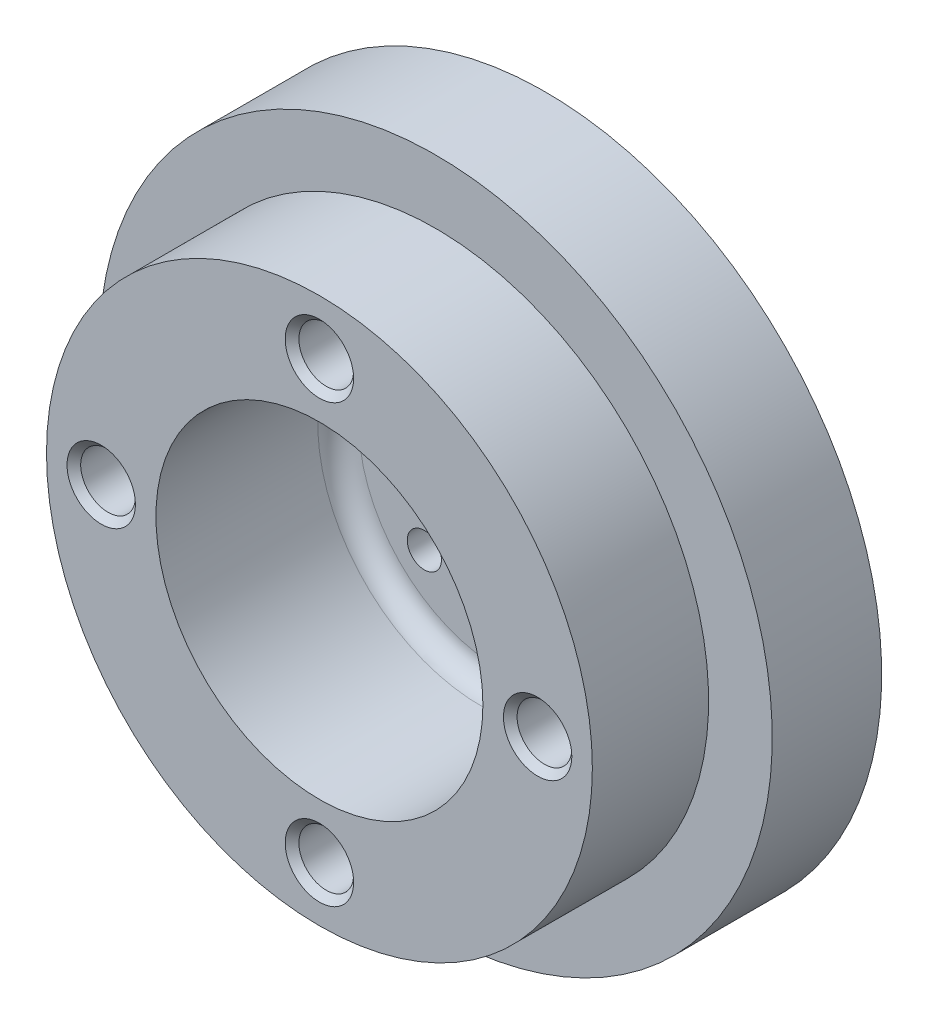
ISO-10303-21;
HEADER;
FILE_DESCRIPTION(('STEP AP214'),'2;1');
FILE_NAME('part.step','',(''),(''),'','','');
FILE_SCHEMA(('AUTOMOTIVE_DESIGN { 1 0 10303 214 1 1 1 1 }'));
ENDSEC;
DATA;
#1=APPLICATION_CONTEXT('core data for automotive mechanical design processes');
#2=APPLICATION_PROTOCOL_DEFINITION('international standard','automotive_design',2000,#1);
#3=PRODUCT_CONTEXT('',#1,'mechanical');
#4=PRODUCT('Part','Part','',(#3));
#5=PRODUCT_RELATED_PRODUCT_CATEGORY('part','',(#4));
#6=PRODUCT_DEFINITION_FORMATION('','',#4);
#7=PRODUCT_DEFINITION_CONTEXT('part definition',#1,'design');
#8=PRODUCT_DEFINITION('design','',#6,#7);
#9=PRODUCT_DEFINITION_SHAPE('','',#8);
#10=(LENGTH_UNIT() NAMED_UNIT(*) SI_UNIT(.MILLI.,.METRE.));
#11=(NAMED_UNIT(*) PLANE_ANGLE_UNIT() SI_UNIT($,.RADIAN.));
#12=(NAMED_UNIT(*) SI_UNIT($,.STERADIAN.) SOLID_ANGLE_UNIT());
#13=UNCERTAINTY_MEASURE_WITH_UNIT(LENGTH_MEASURE(1.E-05),#10,'distance_accuracy_value','');
#14=(GEOMETRIC_REPRESENTATION_CONTEXT(3) GLOBAL_UNCERTAINTY_ASSIGNED_CONTEXT((#13)) GLOBAL_UNIT_ASSIGNED_CONTEXT((#10,
#11,#12)) REPRESENTATION_CONTEXT('',''));
#15=CARTESIAN_POINT('',(0.,0.,0.));
#16=DIRECTION('',(0.,0.,1.));
#17=DIRECTION('',(1.,0.,0.));
#18=AXIS2_PLACEMENT_3D('',#15,#16,#17);
#19=CARTESIAN_POINT('',(1.96630971620501E-13,12.,73.4271211386865));
#20=DIRECTION('',(0.,0.,-1.));
#21=DIRECTION('',(-1.,0.,0.));
#22=AXIS2_PLACEMENT_3D('',#19,#20,#21);
#23=CYLINDRICAL_SURFACE('',#22,19.95);
#24=CARTESIAN_POINT('',(1.96630971620501E-13,12.,16.5));
#25=DIRECTION('',(0.,0.,1.));
#26=DIRECTION('',(1.,0.,0.));
#27=AXIS2_PLACEMENT_3D('',#24,#25,#26);
#28=CIRCLE('',#27,19.95);
#29=CARTESIAN_POINT('',(19.9500000000002,12.,16.5));
#30=VERTEX_POINT('',#29);
#31=EDGE_CURVE('E127',#30,#30,#28,.T.);
#32=ORIENTED_EDGE('',*,*,#31,.F.);
#33=EDGE_LOOP('',(#32));
#34=FACE_BOUND('',#33,.T.);
#35=CARTESIAN_POINT('',(1.96630971620501E-13,12.,8.00000000000004));
#36=DIRECTION('',(0.,0.,-1.));
#37=DIRECTION('',(-1.,0.,0.));
#38=AXIS2_PLACEMENT_3D('',#35,#36,#37);
#39=CIRCLE('',#38,19.95);
#40=CARTESIAN_POINT('',(-19.9499999999998,12.,8.00000000000004));
#41=VERTEX_POINT('',#40);
#42=EDGE_CURVE('E72',#41,#41,#39,.T.);
#43=ORIENTED_EDGE('',*,*,#42,.F.);
#44=EDGE_LOOP('',(#43));
#45=FACE_BOUND('',#44,.T.);
#46=ADVANCED_FACE('F34',(#34,#45),#23,.T.);
#47=CARTESIAN_POINT('',(0.,12.,3.175));
#48=DIRECTION('',(0.,0.,1.));
#49=DIRECTION('',(1.,0.,0.));
#50=AXIS2_PLACEMENT_3D('',#47,#48,#49);
#51=PLANE('',#50);
#52=CARTESIAN_POINT('',(1.41119820389243E-13,12.,3.175));
#53=DIRECTION('',(0.,0.,1.));
#54=DIRECTION('',(1.,0.,0.));
#55=AXIS2_PLACEMENT_3D('',#52,#53,#54);
#56=CIRCLE('',#55,10.45);
#57=CARTESIAN_POINT('',(10.4500000000001,12.,3.175));
#58=VERTEX_POINT('',#57);
#59=EDGE_CURVE('E10',#58,#58,#56,.T.);
#60=ORIENTED_EDGE('',*,*,#59,.T.);
#61=EDGE_LOOP('',(#60));
#62=FACE_BOUND('',#61,.T.);
#63=CARTESIAN_POINT('',(8.00000000000011,12.,3.175));
#64=DIRECTION('',(0.,0.,1.));
#65=DIRECTION('',(1.,0.,0.));
#66=AXIS2_PLACEMENT_3D('',#63,#64,#65);
#67=CIRCLE('',#66,1.24999999999981);
#68=CARTESIAN_POINT('',(9.24999999999992,12.,3.175));
#69=VERTEX_POINT('',#68);
#70=EDGE_CURVE('E121',#69,#69,#67,.T.);
#71=ORIENTED_EDGE('',*,*,#70,.F.);
#72=EDGE_LOOP('',(#71));
#73=FACE_BOUND('',#72,.T.);
#74=CARTESIAN_POINT('',(-5.65685424949228,17.6568542494924,3.175));
#75=DIRECTION('',(0.,0.,1.));
#76=DIRECTION('',(1.,0.,0.));
#77=AXIS2_PLACEMENT_3D('',#74,#75,#76);
#78=CIRCLE('',#77,1.25);
#79=CARTESIAN_POINT('',(-4.40685424949228,17.6568542494924,3.175));
#80=VERTEX_POINT('',#79);
#81=EDGE_CURVE('E109',#80,#80,#78,.T.);
#82=ORIENTED_EDGE('',*,*,#81,.F.);
#83=EDGE_LOOP('',(#82));
#84=FACE_BOUND('',#83,.T.);
#85=CARTESIAN_POINT('',(-5.65685424949246,6.34314575050743,3.175));
#86=DIRECTION('',(0.,0.,1.));
#87=DIRECTION('',(1.,0.,0.));
#88=AXIS2_PLACEMENT_3D('',#85,#86,#87);
#89=CIRCLE('',#88,1.24999999999988);
#90=CARTESIAN_POINT('',(-4.40685424949258,6.34314575050743,3.175));
#91=VERTEX_POINT('',#90);
#92=EDGE_CURVE('E97',#91,#91,#89,.T.);
#93=ORIENTED_EDGE('',*,*,#92,.F.);
#94=EDGE_LOOP('',(#93));
#95=FACE_BOUND('',#94,.T.);
#96=CARTESIAN_POINT('',(0.,3.99999999999978,3.175));
#97=DIRECTION('',(0.,0.,1.));
#98=DIRECTION('',(1.,0.,0.));
#99=AXIS2_PLACEMENT_3D('',#96,#97,#98);
#100=CIRCLE('',#99,1.24999999999977);
#101=CARTESIAN_POINT('',(1.24999999999977,3.99999999999978,3.175));
#102=VERTEX_POINT('',#101);
#103=EDGE_CURVE('E85',#102,#102,#100,.T.);
#104=ORIENTED_EDGE('',*,*,#103,.F.);
#105=EDGE_LOOP('',(#104));
#106=FACE_BOUND('',#105,.T.);
#107=CARTESIAN_POINT('',(0.,12.,3.175));
#108=DIRECTION('',(0.,0.,1.));
#109=DIRECTION('',(1.,0.,0.));
#110=AXIS2_PLACEMENT_3D('',#107,#108,#109);
#111=CIRCLE('',#110,4.2);
#112=CARTESIAN_POINT('',(4.2,12.,3.175));
#113=VERTEX_POINT('',#112);
#114=EDGE_CURVE('E75',#113,#113,#111,.T.);
#115=ORIENTED_EDGE('',*,*,#114,.F.);
#116=EDGE_LOOP('',(#115));
#117=FACE_BOUND('',#116,.T.);
#118=CARTESIAN_POINT('',(5.65685424949246,6.34314575050743,3.175));
#119=DIRECTION('',(0.,0.,1.));
#120=DIRECTION('',(1.,0.,0.));
#121=AXIS2_PLACEMENT_3D('',#118,#119,#120);
#122=CIRCLE('',#121,1.24999999999975);
#123=CARTESIAN_POINT('',(6.90685424949221,6.34314575050743,3.175));
#124=VERTEX_POINT('',#123);
#125=EDGE_CURVE('E79',#124,#124,#122,.T.);
#126=ORIENTED_EDGE('',*,*,#125,.F.);
#127=EDGE_LOOP('',(#126));
#128=FACE_BOUND('',#127,.T.);
#129=CARTESIAN_POINT('',(5.65685424949246,17.6568542494924,3.175));
#130=DIRECTION('',(0.,0.,1.));
#131=DIRECTION('',(1.,0.,0.));
#132=AXIS2_PLACEMENT_3D('',#129,#130,#131);
#133=CIRCLE('',#132,1.24999999999992);
#134=CARTESIAN_POINT('',(6.90685424949238,17.6568542494924,3.175));
#135=VERTEX_POINT('',#134);
#136=EDGE_CURVE('E91',#135,#135,#133,.T.);
#137=ORIENTED_EDGE('',*,*,#136,.F.);
#138=EDGE_LOOP('',(#137));
#139=FACE_BOUND('',#138,.T.);
#140=CARTESIAN_POINT('',(-8.00000000000012,12.,3.175));
#141=DIRECTION('',(0.,0.,1.));
#142=DIRECTION('',(1.,0.,0.));
#143=AXIS2_PLACEMENT_3D('',#140,#141,#142);
#144=CIRCLE('',#143,1.25000000000002);
#145=CARTESIAN_POINT('',(-6.7500000000001,12.,3.175));
#146=VERTEX_POINT('',#145);
#147=EDGE_CURVE('E103',#146,#146,#144,.T.);
#148=ORIENTED_EDGE('',*,*,#147,.F.);
#149=EDGE_LOOP('',(#148));
#150=FACE_BOUND('',#149,.T.);
#151=CARTESIAN_POINT('',(0.,20.,3.175));
#152=DIRECTION('',(0.,0.,1.));
#153=DIRECTION('',(1.,0.,0.));
#154=AXIS2_PLACEMENT_3D('',#151,#152,#153);
#155=CIRCLE('',#154,1.25);
#156=CARTESIAN_POINT('',(1.25,20.,3.175));
#157=VERTEX_POINT('',#156);
#158=EDGE_CURVE('E115',#157,#157,#155,.T.);
#159=ORIENTED_EDGE('',*,*,#158,.F.);
#160=EDGE_LOOP('',(#159));
#161=FACE_BOUND('',#160,.T.);
#162=ADVANCED_FACE('F166',(#62,#73,#84,#95,#106,#117,#128,#139,#150,#161),#51,.T.);
#163=CARTESIAN_POINT('',(0.,12.,0.));
#164=DIRECTION('',(0.,0.,1.));
#165=DIRECTION('',(1.,0.,0.));
#166=AXIS2_PLACEMENT_3D('',#163,#164,#165);
#167=PLANE('',#166);
#168=CARTESIAN_POINT('',(1.96023752785379E-13,-3.95,0.));
#169=DIRECTION('',(0.,0.,1.));
#170=DIRECTION('',(0.,1.,0.));
#171=AXIS2_PLACEMENT_3D('',#168,#169,#170);
#172=CIRCLE('',#171,2.);
#173=CARTESIAN_POINT('',(1.89040790107693E-13,-1.94999999999999,0.));
#174=VERTEX_POINT('',#173);
#175=EDGE_CURVE('E138',#174,#174,#172,.T.);
#176=ORIENTED_EDGE('',*,*,#175,.T.);
#177=EDGE_LOOP('',(#176));
#178=FACE_BOUND('',#177,.T.);
#179=CARTESIAN_POINT('',(15.9500000000001,12.,0.));
#180=DIRECTION('',(0.,0.,1.));
#181=DIRECTION('',(-1.,0.,0.));
#182=AXIS2_PLACEMENT_3D('',#179,#180,#181);
#183=CIRCLE('',#182,2.);
#184=CARTESIAN_POINT('',(13.9500000000001,12.,0.));
#185=VERTEX_POINT('',#184);
#186=EDGE_CURVE('E142',#185,#185,#183,.T.);
#187=ORIENTED_EDGE('',*,*,#186,.T.);
#188=EDGE_LOOP('',(#187));
#189=FACE_BOUND('',#188,.T.);
#190=CARTESIAN_POINT('',(0.,27.9499999999999,0.));
#191=DIRECTION('',(0.,0.,1.));
#192=DIRECTION('',(0.,-1.,0.));
#193=AXIS2_PLACEMENT_3D('',#190,#191,#192);
#194=CIRCLE('',#193,2.);
#195=CARTESIAN_POINT('',(0.,25.9499999999999,0.));
#196=VERTEX_POINT('',#195);
#197=EDGE_CURVE('E139',#196,#196,#194,.T.);
#198=ORIENTED_EDGE('',*,*,#197,.T.);
#199=EDGE_LOOP('',(#198));
#200=FACE_BOUND('',#199,.T.);
#201=CARTESIAN_POINT('',(-15.9499999999998,12.,0.));
#202=DIRECTION('',(0.,0.,1.));
#203=DIRECTION('',(1.,0.,0.));
#204=AXIS2_PLACEMENT_3D('',#201,#202,#203);
#205=CIRCLE('',#204,2.);
#206=CARTESIAN_POINT('',(-13.9499999999998,12.,0.));
#207=VERTEX_POINT('',#206);
#208=EDGE_CURVE('E133',#207,#207,#205,.T.);
#209=ORIENTED_EDGE('',*,*,#208,.T.);
#210=EDGE_LOOP('',(#209));
#211=FACE_BOUND('',#210,.T.);
#212=CARTESIAN_POINT('',(0.,12.,0.));
#213=DIRECTION('',(0.,0.,1.));
#214=DIRECTION('',(1.,0.,0.));
#215=AXIS2_PLACEMENT_3D('',#212,#213,#214);
#216=CIRCLE('',#215,4.2);
#217=CARTESIAN_POINT('',(4.2,12.,0.));
#218=VERTEX_POINT('',#217);
#219=EDGE_CURVE('E76',#218,#218,#216,.T.);
#220=ORIENTED_EDGE('',*,*,#219,.T.);
#221=EDGE_LOOP('',(#220));
#222=FACE_BOUND('',#221,.T.);
#223=CARTESIAN_POINT('',(5.65685424949246,6.34314575050743,0.));
#224=DIRECTION('',(0.,0.,1.));
#225=DIRECTION('',(1.,0.,0.));
#226=AXIS2_PLACEMENT_3D('',#223,#224,#225);
#227=CIRCLE('',#226,1.24999999999975);
#228=CARTESIAN_POINT('',(6.90685424949221,6.34314575050743,0.));
#229=VERTEX_POINT('',#228);
#230=EDGE_CURVE('E82',#229,#229,#227,.T.);
#231=ORIENTED_EDGE('',*,*,#230,.T.);
#232=EDGE_LOOP('',(#231));
#233=FACE_BOUND('',#232,.T.);
#234=CARTESIAN_POINT('',(0.,3.99999999999978,0.));
#235=DIRECTION('',(0.,0.,1.));
#236=DIRECTION('',(1.,0.,0.));
#237=AXIS2_PLACEMENT_3D('',#234,#235,#236);
#238=CIRCLE('',#237,1.24999999999977);
#239=CARTESIAN_POINT('',(1.24999999999977,3.99999999999978,0.));
#240=VERTEX_POINT('',#239);
#241=EDGE_CURVE('E88',#240,#240,#238,.T.);
#242=ORIENTED_EDGE('',*,*,#241,.T.);
#243=EDGE_LOOP('',(#242));
#244=FACE_BOUND('',#243,.T.);
#245=CARTESIAN_POINT('',(5.65685424949246,17.6568542494924,0.));
#246=DIRECTION('',(0.,0.,1.));
#247=DIRECTION('',(1.,0.,0.));
#248=AXIS2_PLACEMENT_3D('',#245,#246,#247);
#249=CIRCLE('',#248,1.24999999999992);
#250=CARTESIAN_POINT('',(6.90685424949238,17.6568542494924,0.));
#251=VERTEX_POINT('',#250);
#252=EDGE_CURVE('E94',#251,#251,#249,.T.);
#253=ORIENTED_EDGE('',*,*,#252,.T.);
#254=EDGE_LOOP('',(#253));
#255=FACE_BOUND('',#254,.T.);
#256=CARTESIAN_POINT('',(-5.65685424949246,6.34314575050743,0.));
#257=DIRECTION('',(0.,0.,1.));
#258=DIRECTION('',(1.,0.,0.));
#259=AXIS2_PLACEMENT_3D('',#256,#257,#258);
#260=CIRCLE('',#259,1.24999999999988);
#261=CARTESIAN_POINT('',(-4.40685424949258,6.34314575050743,0.));
#262=VERTEX_POINT('',#261);
#263=EDGE_CURVE('E100',#262,#262,#260,.T.);
#264=ORIENTED_EDGE('',*,*,#263,.T.);
#265=EDGE_LOOP('',(#264));
#266=FACE_BOUND('',#265,.T.);
#267=CARTESIAN_POINT('',(-8.00000000000012,12.,0.));
#268=DIRECTION('',(0.,0.,1.));
#269=DIRECTION('',(1.,0.,0.));
#270=AXIS2_PLACEMENT_3D('',#267,#268,#269);
#271=CIRCLE('',#270,1.25000000000002);
#272=CARTESIAN_POINT('',(-6.7500000000001,12.,0.));
#273=VERTEX_POINT('',#272);
#274=EDGE_CURVE('E106',#273,#273,#271,.T.);
#275=ORIENTED_EDGE('',*,*,#274,.T.);
#276=EDGE_LOOP('',(#275));
#277=FACE_BOUND('',#276,.T.);
#278=CARTESIAN_POINT('',(-5.65685424949228,17.6568542494924,0.));
#279=DIRECTION('',(0.,0.,1.));
#280=DIRECTION('',(1.,0.,0.));
#281=AXIS2_PLACEMENT_3D('',#278,#279,#280);
#282=CIRCLE('',#281,1.25);
#283=CARTESIAN_POINT('',(-4.40685424949228,17.6568542494924,0.));
#284=VERTEX_POINT('',#283);
#285=EDGE_CURVE('E112',#284,#284,#282,.T.);
#286=ORIENTED_EDGE('',*,*,#285,.T.);
#287=EDGE_LOOP('',(#286));
#288=FACE_BOUND('',#287,.T.);
#289=CARTESIAN_POINT('',(0.,20.,0.));
#290=DIRECTION('',(0.,0.,1.));
#291=DIRECTION('',(1.,0.,0.));
#292=AXIS2_PLACEMENT_3D('',#289,#290,#291);
#293=CIRCLE('',#292,1.25);
#294=CARTESIAN_POINT('',(1.25,20.,0.));
#295=VERTEX_POINT('',#294);
#296=EDGE_CURVE('E118',#295,#295,#293,.T.);
#297=ORIENTED_EDGE('',*,*,#296,.T.);
#298=EDGE_LOOP('',(#297));
#299=FACE_BOUND('',#298,.T.);
#300=CARTESIAN_POINT('',(8.00000000000011,12.,0.));
#301=DIRECTION('',(0.,0.,1.));
#302=DIRECTION('',(1.,0.,0.));
#303=AXIS2_PLACEMENT_3D('',#300,#301,#302);
#304=CIRCLE('',#303,1.24999999999981);
#305=CARTESIAN_POINT('',(9.24999999999992,12.,0.));
#306=VERTEX_POINT('',#305);
#307=EDGE_CURVE('E124',#306,#306,#304,.T.);
#308=ORIENTED_EDGE('',*,*,#307,.T.);
#309=EDGE_LOOP('',(#308));
#310=FACE_BOUND('',#309,.T.);
#311=CARTESIAN_POINT('',(0.,12.,0.));
#312=DIRECTION('',(0.,0.,-1.));
#313=DIRECTION('',(-1.,0.,0.));
#314=AXIS2_PLACEMENT_3D('',#311,#312,#313);
#315=CIRCLE('',#314,24.5999999999998);
#316=CARTESIAN_POINT('',(-24.5999999999998,12.,0.));
#317=VERTEX_POINT('',#316);
#318=EDGE_CURVE('E148',#317,#317,#315,.T.);
#319=ORIENTED_EDGE('',*,*,#318,.T.);
#320=EDGE_LOOP('',(#319));
#321=FACE_BOUND('',#320,.T.);
#322=ADVANCED_FACE('F163',(#178,#189,#200,#211,#222,#233,#244,#255,#266,#277,#288,#299,#310,
#321),#167,.F.);
#323=CARTESIAN_POINT('',(0.,12.,3.175));
#324=DIRECTION('',(0.,0.,-1.));
#325=DIRECTION('',(-1.,0.,0.));
#326=AXIS2_PLACEMENT_3D('',#323,#324,#325);
#327=CYLINDRICAL_SURFACE('',#326,4.2);
#328=ORIENTED_EDGE('',*,*,#114,.T.);
#329=EDGE_LOOP('',(#328));
#330=FACE_BOUND('',#329,.T.);
#331=ORIENTED_EDGE('',*,*,#219,.F.);
#332=EDGE_LOOP('',(#331));
#333=FACE_BOUND('',#332,.T.);
#334=ADVANCED_FACE('F165',(#330,#333),#327,.F.);
#335=CARTESIAN_POINT('',(5.65685424949246,6.34314575050743,3.175));
#336=DIRECTION('',(0.,0.,-1.));
#337=DIRECTION('',(-1.,0.,0.));
#338=AXIS2_PLACEMENT_3D('',#335,#336,#337);
#339=CYLINDRICAL_SURFACE('',#338,1.24999999999975);
#340=ORIENTED_EDGE('',*,*,#125,.T.);
#341=EDGE_LOOP('',(#340));
#342=FACE_BOUND('',#341,.T.);
#343=ORIENTED_EDGE('',*,*,#230,.F.);
#344=EDGE_LOOP('',(#343));
#345=FACE_BOUND('',#344,.T.);
#346=ADVANCED_FACE('F173',(#342,#345),#339,.F.);
#347=CARTESIAN_POINT('',(0.,3.99999999999978,3.175));
#348=DIRECTION('',(0.,0.,-1.));
#349=DIRECTION('',(-1.,0.,0.));
#350=AXIS2_PLACEMENT_3D('',#347,#348,#349);
#351=CYLINDRICAL_SURFACE('',#350,1.24999999999977);
#352=ORIENTED_EDGE('',*,*,#103,.T.);
#353=EDGE_LOOP('',(#352));
#354=FACE_BOUND('',#353,.T.);
#355=ORIENTED_EDGE('',*,*,#241,.F.);
#356=EDGE_LOOP('',(#355));
#357=FACE_BOUND('',#356,.T.);
#358=ADVANCED_FACE('F213',(#354,#357),#351,.F.);
#359=CARTESIAN_POINT('',(5.65685424949246,17.6568542494924,3.175));
#360=DIRECTION('',(0.,0.,-1.));
#361=DIRECTION('',(-1.,0.,0.));
#362=AXIS2_PLACEMENT_3D('',#359,#360,#361);
#363=CYLINDRICAL_SURFACE('',#362,1.24999999999992);
#364=ORIENTED_EDGE('',*,*,#136,.T.);
#365=EDGE_LOOP('',(#364));
#366=FACE_BOUND('',#365,.T.);
#367=ORIENTED_EDGE('',*,*,#252,.F.);
#368=EDGE_LOOP('',(#367));
#369=FACE_BOUND('',#368,.T.);
#370=ADVANCED_FACE('F209',(#366,#369),#363,.F.);
#371=CARTESIAN_POINT('',(-5.65685424949246,6.34314575050743,3.175));
#372=DIRECTION('',(0.,0.,-1.));
#373=DIRECTION('',(-1.,0.,0.));
#374=AXIS2_PLACEMENT_3D('',#371,#372,#373);
#375=CYLINDRICAL_SURFACE('',#374,1.24999999999988);
#376=ORIENTED_EDGE('',*,*,#92,.T.);
#377=EDGE_LOOP('',(#376));
#378=FACE_BOUND('',#377,.T.);
#379=ORIENTED_EDGE('',*,*,#263,.F.);
#380=EDGE_LOOP('',(#379));
#381=FACE_BOUND('',#380,.T.);
#382=ADVANCED_FACE('F205',(#378,#381),#375,.F.);
#383=CARTESIAN_POINT('',(-8.00000000000012,12.,3.175));
#384=DIRECTION('',(0.,0.,-1.));
#385=DIRECTION('',(-1.,0.,0.));
#386=AXIS2_PLACEMENT_3D('',#383,#384,#385);
#387=CYLINDRICAL_SURFACE('',#386,1.25000000000002);
#388=ORIENTED_EDGE('',*,*,#147,.T.);
#389=EDGE_LOOP('',(#388));
#390=FACE_BOUND('',#389,.T.);
#391=ORIENTED_EDGE('',*,*,#274,.F.);
#392=EDGE_LOOP('',(#391));
#393=FACE_BOUND('',#392,.T.);
#394=ADVANCED_FACE('F201',(#390,#393),#387,.F.);
#395=CARTESIAN_POINT('',(-5.65685424949228,17.6568542494924,3.175));
#396=DIRECTION('',(0.,0.,-1.));
#397=DIRECTION('',(-1.,0.,0.));
#398=AXIS2_PLACEMENT_3D('',#395,#396,#397);
#399=CYLINDRICAL_SURFACE('',#398,1.25);
#400=ORIENTED_EDGE('',*,*,#81,.T.);
#401=EDGE_LOOP('',(#400));
#402=FACE_BOUND('',#401,.T.);
#403=ORIENTED_EDGE('',*,*,#285,.F.);
#404=EDGE_LOOP('',(#403));
#405=FACE_BOUND('',#404,.T.);
#406=ADVANCED_FACE('F197',(#402,#405),#399,.F.);
#407=CARTESIAN_POINT('',(0.,20.,3.175));
#408=DIRECTION('',(0.,0.,-1.));
#409=DIRECTION('',(-1.,0.,0.));
#410=AXIS2_PLACEMENT_3D('',#407,#408,#409);
#411=CYLINDRICAL_SURFACE('',#410,1.25);
#412=ORIENTED_EDGE('',*,*,#158,.T.);
#413=EDGE_LOOP('',(#412));
#414=FACE_BOUND('',#413,.T.);
#415=ORIENTED_EDGE('',*,*,#296,.F.);
#416=EDGE_LOOP('',(#415));
#417=FACE_BOUND('',#416,.T.);
#418=ADVANCED_FACE('F193',(#414,#417),#411,.F.);
#419=CARTESIAN_POINT('',(8.00000000000011,12.,3.175));
#420=DIRECTION('',(0.,0.,-1.));
#421=DIRECTION('',(-1.,0.,0.));
#422=AXIS2_PLACEMENT_3D('',#419,#420,#421);
#423=CYLINDRICAL_SURFACE('',#422,1.24999999999981);
#424=ORIENTED_EDGE('',*,*,#70,.T.);
#425=EDGE_LOOP('',(#424));
#426=FACE_BOUND('',#425,.T.);
#427=ORIENTED_EDGE('',*,*,#307,.F.);
#428=EDGE_LOOP('',(#427));
#429=FACE_BOUND('',#428,.T.);
#430=ADVANCED_FACE('F190',(#426,#429),#423,.F.);
#431=CARTESIAN_POINT('',(1.41119820389243E-13,12.,73.4271211386865));
#432=DIRECTION('',(0.,0.,-1.));
#433=DIRECTION('',(-1.,0.,0.));
#434=AXIS2_PLACEMENT_3D('',#431,#432,#433);
#435=CYLINDRICAL_SURFACE('',#434,11.95);
#436=CARTESIAN_POINT('',(1.41119820389243E-13,12.,4.675));
#437=DIRECTION('',(0.,0.,1.));
#438=DIRECTION('',(1.,0.,0.));
#439=AXIS2_PLACEMENT_3D('',#436,#437,#438);
#440=CIRCLE('',#439,11.95);
#441=CARTESIAN_POINT('',(11.9500000000001,12.,4.675));
#442=VERTEX_POINT('',#441);
#443=EDGE_CURVE('E41',#442,#442,#440,.F.);
#444=ORIENTED_EDGE('',*,*,#443,.T.);
#445=EDGE_LOOP('',(#444));
#446=FACE_BOUND('',#445,.T.);
#447=CARTESIAN_POINT('',(1.41119820389243E-13,12.,16.5));
#448=DIRECTION('',(0.,0.,1.));
#449=DIRECTION('',(1.,0.,0.));
#450=AXIS2_PLACEMENT_3D('',#447,#448,#449);
#451=CIRCLE('',#450,11.95);
#452=CARTESIAN_POINT('',(11.9500000000001,12.,16.5));
#453=VERTEX_POINT('',#452);
#454=EDGE_CURVE('E130',#453,#453,#451,.T.);
#455=ORIENTED_EDGE('',*,*,#454,.T.);
#456=EDGE_LOOP('',(#455));
#457=FACE_BOUND('',#456,.T.);
#458=ADVANCED_FACE('F188',(#446,#457),#435,.F.);
#459=CARTESIAN_POINT('',(25.0569780560725,-12.6,16.5));
#460=DIRECTION('',(0.,0.,1.));
#461=DIRECTION('',(0.,1.,0.));
#462=AXIS2_PLACEMENT_3D('',#459,#460,#461);
#463=PLANE('',#462);
#464=CARTESIAN_POINT('',(15.9500000000001,12.,16.5));
#465=DIRECTION('',(0.,0.,1.));
#466=DIRECTION('',(1.,0.,0.));
#467=AXIS2_PLACEMENT_3D('',#464,#465,#466);
#468=CIRCLE('',#467,2.5);
#469=CARTESIAN_POINT('',(18.4500000000001,12.,16.5));
#470=VERTEX_POINT('',#469);
#471=EDGE_CURVE('E57',#470,#470,#468,.F.);
#472=ORIENTED_EDGE('',*,*,#471,.T.);
#473=EDGE_LOOP('',(#472));
#474=FACE_BOUND('',#473,.T.);
#475=CARTESIAN_POINT('',(0.,27.9499999999999,16.5));
#476=DIRECTION('',(0.,0.,1.));
#477=DIRECTION('',(1.,0.,0.));
#478=AXIS2_PLACEMENT_3D('',#475,#476,#477);
#479=CIRCLE('',#478,2.5);
#480=CARTESIAN_POINT('',(2.49999999999997,27.9499999999999,16.5));
#481=VERTEX_POINT('',#480);
#482=EDGE_CURVE('E60',#481,#481,#479,.F.);
#483=ORIENTED_EDGE('',*,*,#482,.T.);
#484=EDGE_LOOP('',(#483));
#485=FACE_BOUND('',#484,.T.);
#486=CARTESIAN_POINT('',(1.96023752785379E-13,-3.95,16.5));
#487=DIRECTION('',(0.,0.,1.));
#488=DIRECTION('',(1.,0.,0.));
#489=AXIS2_PLACEMENT_3D('',#486,#487,#488);
#490=CIRCLE('',#489,2.5);
#491=CARTESIAN_POINT('',(2.5000000000002,-3.95,16.5));
#492=VERTEX_POINT('',#491);
#493=EDGE_CURVE('E63',#492,#492,#490,.F.);
#494=ORIENTED_EDGE('',*,*,#493,.T.);
#495=EDGE_LOOP('',(#494));
#496=FACE_BOUND('',#495,.T.);
#497=CARTESIAN_POINT('',(-15.9499999999998,12.,16.5));
#498=DIRECTION('',(0.,0.,1.));
#499=DIRECTION('',(1.,0.,0.));
#500=AXIS2_PLACEMENT_3D('',#497,#498,#499);
#501=CIRCLE('',#500,2.5);
#502=CARTESIAN_POINT('',(-13.4499999999998,12.,16.5));
#503=VERTEX_POINT('',#502);
#504=EDGE_CURVE('E66',#503,#503,#501,.F.);
#505=ORIENTED_EDGE('',*,*,#504,.T.);
#506=EDGE_LOOP('',(#505));
#507=FACE_BOUND('',#506,.T.);
#508=ORIENTED_EDGE('',*,*,#454,.F.);
#509=EDGE_LOOP('',(#508));
#510=FACE_BOUND('',#509,.T.);
#511=ORIENTED_EDGE('',*,*,#31,.T.);
#512=EDGE_LOOP('',(#511));
#513=FACE_BOUND('',#512,.T.);
#514=ADVANCED_FACE('F290',(#474,#485,#496,#507,#510,#513),#463,.T.);
#515=CARTESIAN_POINT('',(-15.9499999999998,12.,0.));
#516=DIRECTION('',(0.,0.,1.));
#517=DIRECTION('',(1.,0.,0.));
#518=AXIS2_PLACEMENT_3D('',#515,#516,#517);
#519=CYLINDRICAL_SURFACE('',#518,2.);
#520=CARTESIAN_POINT('',(-15.9499999999998,12.,16.));
#521=DIRECTION('',(0.,0.,1.));
#522=DIRECTION('',(1.,0.,0.));
#523=AXIS2_PLACEMENT_3D('',#520,#521,#522);
#524=CIRCLE('',#523,2.);
#525=CARTESIAN_POINT('',(-13.9499999999998,12.,16.));
#526=VERTEX_POINT('',#525);
#527=EDGE_CURVE('E45',#526,#526,#524,.T.);
#528=ORIENTED_EDGE('',*,*,#527,.T.);
#529=EDGE_LOOP('',(#528));
#530=FACE_BOUND('',#529,.T.);
#531=ORIENTED_EDGE('',*,*,#208,.F.);
#532=EDGE_LOOP('',(#531));
#533=FACE_BOUND('',#532,.T.);
#534=ADVANCED_FACE('F298',(#530,#533),#519,.F.);
#535=CARTESIAN_POINT('',(0.,27.9499999999999,0.));
#536=DIRECTION('',(0.,0.,1.));
#537=DIRECTION('',(1.,0.,0.));
#538=AXIS2_PLACEMENT_3D('',#535,#536,#537);
#539=CYLINDRICAL_SURFACE('',#538,2.);
#540=CARTESIAN_POINT('',(0.,27.9499999999999,16.));
#541=DIRECTION('',(0.,0.,1.));
#542=DIRECTION('',(1.,0.,0.));
#543=AXIS2_PLACEMENT_3D('',#540,#541,#542);
#544=CIRCLE('',#543,2.);
#545=CARTESIAN_POINT('',(1.99999999999998,27.9499999999999,16.));
#546=VERTEX_POINT('',#545);
#547=EDGE_CURVE('E54',#546,#546,#544,.T.);
#548=ORIENTED_EDGE('',*,*,#547,.T.);
#549=EDGE_LOOP('',(#548));
#550=FACE_BOUND('',#549,.T.);
#551=ORIENTED_EDGE('',*,*,#197,.F.);
#552=EDGE_LOOP('',(#551));
#553=FACE_BOUND('',#552,.T.);
#554=ADVANCED_FACE('F306',(#550,#553),#539,.F.);
#555=CARTESIAN_POINT('',(15.9500000000001,12.,0.));
#556=DIRECTION('',(0.,0.,1.));
#557=DIRECTION('',(1.,0.,0.));
#558=AXIS2_PLACEMENT_3D('',#555,#556,#557);
#559=CYLINDRICAL_SURFACE('',#558,2.);
#560=CARTESIAN_POINT('',(15.9500000000001,12.,16.));
#561=DIRECTION('',(0.,0.,1.));
#562=DIRECTION('',(1.,0.,0.));
#563=AXIS2_PLACEMENT_3D('',#560,#561,#562);
#564=CIRCLE('',#563,2.);
#565=CARTESIAN_POINT('',(17.9500000000001,12.,16.));
#566=VERTEX_POINT('',#565);
#567=EDGE_CURVE('E69',#566,#566,#564,.T.);
#568=ORIENTED_EDGE('',*,*,#567,.T.);
#569=EDGE_LOOP('',(#568));
#570=FACE_BOUND('',#569,.T.);
#571=ORIENTED_EDGE('',*,*,#186,.F.);
#572=EDGE_LOOP('',(#571));
#573=FACE_BOUND('',#572,.T.);
#574=ADVANCED_FACE('F314',(#570,#573),#559,.F.);
#575=CARTESIAN_POINT('',(1.96023752785379E-13,-3.95,0.));
#576=DIRECTION('',(0.,0.,1.));
#577=DIRECTION('',(1.,0.,0.));
#578=AXIS2_PLACEMENT_3D('',#575,#576,#577);
#579=CYLINDRICAL_SURFACE('',#578,2.);
#580=CARTESIAN_POINT('',(1.96023752785379E-13,-3.95,16.));
#581=DIRECTION('',(0.,0.,1.));
#582=DIRECTION('',(1.,0.,0.));
#583=AXIS2_PLACEMENT_3D('',#580,#581,#582);
#584=CIRCLE('',#583,2.);
#585=CARTESIAN_POINT('',(2.0000000000002,-3.95,16.));
#586=VERTEX_POINT('',#585);
#587=EDGE_CURVE('E49',#586,#586,#584,.T.);
#588=ORIENTED_EDGE('',*,*,#587,.T.);
#589=EDGE_LOOP('',(#588));
#590=FACE_BOUND('',#589,.T.);
#591=ORIENTED_EDGE('',*,*,#175,.F.);
#592=EDGE_LOOP('',(#591));
#593=FACE_BOUND('',#592,.T.);
#594=ADVANCED_FACE('F159',(#590,#593),#579,.F.);
#595=CARTESIAN_POINT('',(0.,12.,77.5793072687558));
#596=DIRECTION('',(0.,0.,-1.));
#597=DIRECTION('',(-1.,0.,0.));
#598=AXIS2_PLACEMENT_3D('',#595,#596,#597);
#599=CYLINDRICAL_SURFACE('',#598,24.5999999999998);
#600=CARTESIAN_POINT('',(0.,12.,8.00000000000002));
#601=DIRECTION('',(0.,0.,-1.));
#602=DIRECTION('',(-1.,0.,0.));
#603=AXIS2_PLACEMENT_3D('',#600,#601,#602);
#604=CIRCLE('',#603,24.5999999999998);
#605=CARTESIAN_POINT('',(-24.5999999999998,12.,8.00000000000003));
#606=VERTEX_POINT('',#605);
#607=EDGE_CURVE('E143',#606,#606,#604,.F.);
#608=ORIENTED_EDGE('',*,*,#607,.F.);
#609=EDGE_LOOP('',(#608));
#610=FACE_BOUND('',#609,.T.);
#611=ORIENTED_EDGE('',*,*,#318,.F.);
#612=EDGE_LOOP('',(#611));
#613=FACE_BOUND('',#612,.T.);
#614=ADVANCED_FACE('F156',(#610,#613),#599,.T.);
#615=CARTESIAN_POINT('',(25.0569780560725,36.6,8.00000000000001));
#616=DIRECTION('',(0.,0.,-1.));
#617=DIRECTION('',(0.,-1.,0.));
#618=AXIS2_PLACEMENT_3D('',#615,#616,#617);
#619=PLANE('',#618);
#620=ORIENTED_EDGE('',*,*,#42,.T.);
#621=EDGE_LOOP('',(#620));
#622=FACE_BOUND('',#621,.T.);
#623=ORIENTED_EDGE('',*,*,#607,.T.);
#624=EDGE_LOOP('',(#623));
#625=FACE_BOUND('',#624,.T.);
#626=ADVANCED_FACE('F154',(#622,#625),#619,.F.);
#627=CARTESIAN_POINT('',(15.9500000000001,12.,16.));
#628=DIRECTION('',(0.,0.,1.));
#629=DIRECTION('',(1.,0.,0.));
#630=AXIS2_PLACEMENT_3D('',#627,#628,#629);
#631=CONICAL_SURFACE('',#630,2.,0.785398163397452);
#632=ORIENTED_EDGE('',*,*,#471,.F.);
#633=EDGE_LOOP('',(#632));
#634=FACE_BOUND('',#633,.T.);
#635=ORIENTED_EDGE('',*,*,#567,.F.);
#636=EDGE_LOOP('',(#635));
#637=FACE_BOUND('',#636,.T.);
#638=ADVANCED_FACE('F340',(#634,#637),#631,.F.);
#639=CARTESIAN_POINT('',(0.,27.9499999999999,16.));
#640=DIRECTION('',(0.,0.,1.));
#641=DIRECTION('',(1.,0.,0.));
#642=AXIS2_PLACEMENT_3D('',#639,#640,#641);
#643=CONICAL_SURFACE('',#642,2.,0.785398163397452);
#644=ORIENTED_EDGE('',*,*,#482,.F.);
#645=EDGE_LOOP('',(#644));
#646=FACE_BOUND('',#645,.T.);
#647=ORIENTED_EDGE('',*,*,#547,.F.);
#648=EDGE_LOOP('',(#647));
#649=FACE_BOUND('',#648,.T.);
#650=ADVANCED_FACE('F347',(#646,#649),#643,.F.);
#651=CARTESIAN_POINT('',(1.96023752785379E-13,-3.95,16.));
#652=DIRECTION('',(0.,0.,1.));
#653=DIRECTION('',(1.,0.,0.));
#654=AXIS2_PLACEMENT_3D('',#651,#652,#653);
#655=CONICAL_SURFACE('',#654,2.,0.785398163397447);
#656=ORIENTED_EDGE('',*,*,#493,.F.);
#657=EDGE_LOOP('',(#656));
#658=FACE_BOUND('',#657,.T.);
#659=ORIENTED_EDGE('',*,*,#587,.F.);
#660=EDGE_LOOP('',(#659));
#661=FACE_BOUND('',#660,.T.);
#662=ADVANCED_FACE('F354',(#658,#661),#655,.F.);
#663=CARTESIAN_POINT('',(-15.9499999999998,12.,16.));
#664=DIRECTION('',(0.,0.,1.));
#665=DIRECTION('',(1.,0.,0.));
#666=AXIS2_PLACEMENT_3D('',#663,#664,#665);
#667=CONICAL_SURFACE('',#666,2.,0.785398163397456);
#668=ORIENTED_EDGE('',*,*,#504,.F.);
#669=EDGE_LOOP('',(#668));
#670=FACE_BOUND('',#669,.T.);
#671=ORIENTED_EDGE('',*,*,#527,.F.);
#672=EDGE_LOOP('',(#671));
#673=FACE_BOUND('',#672,.T.);
#674=ADVANCED_FACE('F362',(#670,#673),#667,.F.);
#675=CARTESIAN_POINT('',(1.41119820389243E-13,12.,4.675));
#676=DIRECTION('',(0.,0.,1.));
#677=DIRECTION('',(1.,0.,0.));
#678=AXIS2_PLACEMENT_3D('',#675,#676,#677);
#679=TOROIDAL_SURFACE('',#678,10.45,1.5);
#680=ORIENTED_EDGE('',*,*,#59,.F.);
#681=EDGE_LOOP('',(#680));
#682=FACE_BOUND('',#681,.T.);
#683=ORIENTED_EDGE('',*,*,#443,.F.);
#684=EDGE_LOOP('',(#683));
#685=FACE_BOUND('',#684,.T.);
#686=ADVANCED_FACE('F36',(#682,#685),#679,.F.);
#687=CLOSED_SHELL('',(#46,#162,#322,#334,#346,#358,#370,#382,#394,#406,#418,#430,#458,#514,#534,
#554,#574,#594,#614,#626,#638,#650,#662,#674,#686));
#688=MANIFOLD_SOLID_BREP('B2',#687);
#689=ADVANCED_BREP_SHAPE_REPRESENTATION('',(#18,#688),#14);
#690=SHAPE_DEFINITION_REPRESENTATION(#9,#689);
ENDSEC;
END-ISO-10303-21;
